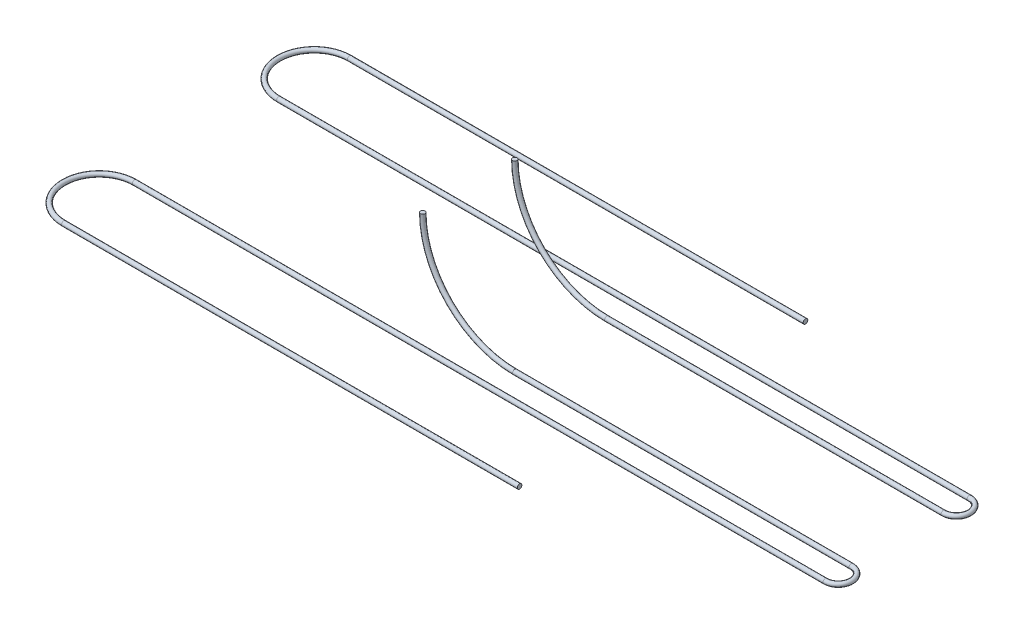
ISO-10303-21;
HEADER;
FILE_DESCRIPTION(('STEP AP214'),'2;1');
FILE_NAME('part.step','',(''),(''),'','','');
FILE_SCHEMA(('AUTOMOTIVE_DESIGN { 1 0 10303 214 1 1 1 1 }'));
ENDSEC;
DATA;
#1=APPLICATION_CONTEXT('core data for automotive mechanical design processes');
#2=APPLICATION_PROTOCOL_DEFINITION('international standard','automotive_design',2000,#1);
#3=PRODUCT_CONTEXT('',#1,'mechanical');
#4=PRODUCT('Part','Part','',(#3));
#5=PRODUCT_RELATED_PRODUCT_CATEGORY('part','',(#4));
#6=PRODUCT_DEFINITION_FORMATION('','',#4);
#7=PRODUCT_DEFINITION_CONTEXT('part definition',#1,'design');
#8=PRODUCT_DEFINITION('design','',#6,#7);
#9=PRODUCT_DEFINITION_SHAPE('','',#8);
#10=(LENGTH_UNIT() NAMED_UNIT(*) SI_UNIT(.MILLI.,.METRE.));
#11=(NAMED_UNIT(*) PLANE_ANGLE_UNIT() SI_UNIT($,.RADIAN.));
#12=(NAMED_UNIT(*) SI_UNIT($,.STERADIAN.) SOLID_ANGLE_UNIT());
#13=UNCERTAINTY_MEASURE_WITH_UNIT(LENGTH_MEASURE(1.E-05),#10,'distance_accuracy_value','');
#14=(GEOMETRIC_REPRESENTATION_CONTEXT(3) GLOBAL_UNCERTAINTY_ASSIGNED_CONTEXT((#13)) GLOBAL_UNIT_ASSIGNED_CONTEXT((#10,
#11,#12)) REPRESENTATION_CONTEXT('',''));
#15=CARTESIAN_POINT('',(0.,0.,0.));
#16=DIRECTION('',(0.,0.,1.));
#17=DIRECTION('',(1.,0.,0.));
#18=AXIS2_PLACEMENT_3D('',#15,#16,#17);
#19=CARTESIAN_POINT('',(22.09,0.,31.05));
#20=DIRECTION('',(1.,0.,0.));
#21=DIRECTION('',(0.,0.,1.));
#22=AXIS2_PLACEMENT_3D('',#19,#20,#21);
#23=PLANE('',#22);
#24=CARTESIAN_POINT('',(22.09,0.,31.05));
#25=DIRECTION('',(-1.,0.,0.));
#26=DIRECTION('',(0.,0.,1.));
#27=AXIS2_PLACEMENT_3D('',#24,#25,#26);
#28=CIRCLE('',#27,0.499999999999999);
#29=CARTESIAN_POINT('',(22.09,0.,31.55));
#30=VERTEX_POINT('',#29);
#31=EDGE_CURVE('E76',#30,#30,#28,.T.);
#32=ORIENTED_EDGE('',*,*,#31,.F.);
#33=EDGE_LOOP('',(#32));
#34=FACE_BOUND('',#33,.T.);
#35=ADVANCED_FACE('F45',(#34),#23,.T.);
#36=CARTESIAN_POINT('',(-20.,20.,10.));
#37=DIRECTION('',(0.,-1.,0.));
#38=DIRECTION('',(0.,0.,1.));
#39=AXIS2_PLACEMENT_3D('',#36,#37,#38);
#40=PLANE('',#39);
#41=CARTESIAN_POINT('',(-20.,20.,10.));
#42=DIRECTION('',(0.,1.,0.));
#43=DIRECTION('',(0.,0.,1.));
#44=AXIS2_PLACEMENT_3D('',#41,#42,#43);
#45=CIRCLE('',#44,0.499999999999999);
#46=CARTESIAN_POINT('',(-20.5,20.,10.));
#47=VERTEX_POINT('',#46);
#48=EDGE_CURVE('E11',#47,#47,#45,.T.);
#49=ORIENTED_EDGE('',*,*,#48,.T.);
#50=EDGE_LOOP('',(#49));
#51=FACE_BOUND('',#50,.T.);
#52=ADVANCED_FACE('F84',(#51),#40,.F.);
#53=CARTESIAN_POINT('',(22.09,0.,31.05));
#54=DIRECTION('',(-1.,0.,0.));
#55=DIRECTION('',(0.,0.,-1.));
#56=AXIS2_PLACEMENT_3D('',#53,#54,#55);
#57=CYLINDRICAL_SURFACE('',#56,0.499999999999999);
#58=CARTESIAN_POINT('',(-76.91,0.,31.05));
#59=DIRECTION('',(-1.,0.,0.));
#60=DIRECTION('',(0.,0.,1.));
#61=AXIS2_PLACEMENT_3D('',#58,#59,#60);
#62=CIRCLE('',#61,0.499999999999999);
#63=CARTESIAN_POINT('',(-76.91,0.,31.55));
#64=VERTEX_POINT('',#63);
#65=EDGE_CURVE('E72',#64,#64,#62,.T.);
#66=ORIENTED_EDGE('',*,*,#65,.F.);
#67=EDGE_LOOP('',(#66));
#68=FACE_BOUND('',#67,.T.);
#69=ORIENTED_EDGE('',*,*,#31,.T.);
#70=EDGE_LOOP('',(#69));
#71=FACE_BOUND('',#70,.T.);
#72=ADVANCED_FACE('F81',(#68,#71),#57,.T.);
#73=CARTESIAN_POINT('',(-76.91,0.,23.35));
#74=DIRECTION('',(0.,1.,0.));
#75=DIRECTION('',(0.,0.,-1.));
#76=AXIS2_PLACEMENT_3D('',#73,#74,#75);
#77=TOROIDAL_SURFACE('',#76,7.70000000000001,0.499999999999999);
#78=CARTESIAN_POINT('',(-76.91,0.,15.65));
#79=DIRECTION('',(1.,0.,0.));
#80=DIRECTION('',(0.,0.,-1.));
#81=AXIS2_PLACEMENT_3D('',#78,#79,#80);
#82=CIRCLE('',#81,0.499999999999999);
#83=CARTESIAN_POINT('',(-76.91,0.,15.15));
#84=VERTEX_POINT('',#83);
#85=EDGE_CURVE('E68',#84,#84,#82,.T.);
#86=CARTESIAN_POINT('',(-76.91,0.,23.35));
#87=DIRECTION('',(0.,1.,0.));
#88=DIRECTION('',(0.,0.,-1.));
#89=AXIS2_PLACEMENT_3D('',#86,#87,#88);
#90=CIRCLE('',#89,8.20000000000001);
#91=EDGE_CURVE('',#84,#64,#90,.T.);
#92=ORIENTED_EDGE('',*,*,#85,.F.);
#93=ORIENTED_EDGE('',*,*,#65,.T.);
#94=ORIENTED_EDGE('',*,*,#91,.T.);
#95=ORIENTED_EDGE('',*,*,#91,.F.);
#96=EDGE_LOOP('',(#92,#94,#93,#95));
#97=FACE_BOUND('',#96,.T.);
#98=ADVANCED_FACE('F91',(#97),#77,.T.);
#99=CARTESIAN_POINT('',(-76.91,0.,15.65));
#100=DIRECTION('',(1.,0.,0.));
#101=DIRECTION('',(0.,0.,1.));
#102=AXIS2_PLACEMENT_3D('',#99,#100,#101);
#103=CYLINDRICAL_SURFACE('',#102,0.499999999999999);
#104=CARTESIAN_POINT('',(73.09,0.,15.65));
#105=DIRECTION('',(1.,0.,0.));
#106=DIRECTION('',(0.,0.,-1.));
#107=AXIS2_PLACEMENT_3D('',#104,#105,#106);
#108=CIRCLE('',#107,0.499999999999999);
#109=CARTESIAN_POINT('',(73.09,0.,16.15));
#110=VERTEX_POINT('',#109);
#111=EDGE_CURVE('E62',#110,#110,#108,.T.);
#112=ORIENTED_EDGE('',*,*,#111,.F.);
#113=EDGE_LOOP('',(#112));
#114=FACE_BOUND('',#113,.T.);
#115=ORIENTED_EDGE('',*,*,#85,.T.);
#116=EDGE_LOOP('',(#115));
#117=FACE_BOUND('',#116,.T.);
#118=ADVANCED_FACE('F106',(#114,#117),#103,.T.);
#119=CARTESIAN_POINT('',(73.09,0.,12.825));
#120=DIRECTION('',(0.,-1.,0.));
#121=DIRECTION('',(0.,0.,1.));
#122=AXIS2_PLACEMENT_3D('',#119,#120,#121);
#123=TOROIDAL_SURFACE('',#122,2.82499999999998,0.499999999999999);
#124=CARTESIAN_POINT('',(73.09,0.,10.));
#125=DIRECTION('',(-1.,0.,0.));
#126=DIRECTION('',(0.,0.,1.));
#127=AXIS2_PLACEMENT_3D('',#124,#125,#126);
#128=CIRCLE('',#127,0.499999999999999);
#129=CARTESIAN_POINT('',(73.09,0.,9.50000000000002));
#130=VERTEX_POINT('',#129);
#131=EDGE_CURVE('E57',#130,#130,#128,.T.);
#132=CARTESIAN_POINT('',(73.09,0.,12.825));
#133=DIRECTION('',(0.,-1.,0.));
#134=DIRECTION('',(0.,0.,1.));
#135=AXIS2_PLACEMENT_3D('',#132,#133,#134);
#136=CIRCLE('',#135,3.32499999999998);
#137=EDGE_CURVE('',#130,#110,#136,.T.);
#138=ORIENTED_EDGE('',*,*,#131,.F.);
#139=ORIENTED_EDGE('',*,*,#111,.T.);
#140=ORIENTED_EDGE('',*,*,#137,.T.);
#141=ORIENTED_EDGE('',*,*,#137,.F.);
#142=EDGE_LOOP('',(#138,#140,#139,#141));
#143=FACE_BOUND('',#142,.T.);
#144=ADVANCED_FACE('F102',(#143),#123,.T.);
#145=CARTESIAN_POINT('',(73.09,0.,10.));
#146=DIRECTION('',(-1.,0.,0.));
#147=DIRECTION('',(0.,0.,-1.));
#148=AXIS2_PLACEMENT_3D('',#145,#146,#147);
#149=CYLINDRICAL_SURFACE('',#148,0.499999999999999);
#150=CARTESIAN_POINT('',(0.,0.,10.));
#151=DIRECTION('',(-1.,0.,0.));
#152=DIRECTION('',(0.,0.,1.));
#153=AXIS2_PLACEMENT_3D('',#150,#151,#152);
#154=CIRCLE('',#153,0.499999999999999);
#155=CARTESIAN_POINT('',(0.,-0.500000000000004,10.));
#156=VERTEX_POINT('',#155);
#157=EDGE_CURVE('E52',#156,#156,#154,.T.);
#158=ORIENTED_EDGE('',*,*,#157,.F.);
#159=EDGE_LOOP('',(#158));
#160=FACE_BOUND('',#159,.T.);
#161=ORIENTED_EDGE('',*,*,#131,.T.);
#162=EDGE_LOOP('',(#161));
#163=FACE_BOUND('',#162,.T.);
#164=ADVANCED_FACE('F98',(#160,#163),#149,.T.);
#165=CARTESIAN_POINT('',(0.,20.,10.));
#166=DIRECTION('',(0.,0.,1.));
#167=DIRECTION('',(-1.,0.,0.));
#168=AXIS2_PLACEMENT_3D('',#165,#166,#167);
#169=TOROIDAL_SURFACE('',#168,20.,0.499999999999999);
#170=CARTESIAN_POINT('',(0.,20.,10.));
#171=DIRECTION('',(0.,0.,1.));
#172=DIRECTION('',(-1.,0.,0.));
#173=AXIS2_PLACEMENT_3D('',#170,#171,#172);
#174=CIRCLE('',#173,20.5);
#175=EDGE_CURVE('',#47,#156,#174,.T.);
#176=ORIENTED_EDGE('',*,*,#48,.F.);
#177=ORIENTED_EDGE('',*,*,#157,.T.);
#178=ORIENTED_EDGE('',*,*,#175,.T.);
#179=ORIENTED_EDGE('',*,*,#175,.F.);
#180=EDGE_LOOP('',(#176,#178,#177,#179));
#181=FACE_BOUND('',#180,.T.);
#182=ADVANCED_FACE('F95',(#181),#169,.T.);
#183=CLOSED_SHELL('',(#35,#52,#72,#98,#118,#144,#164,#182));
#184=MANIFOLD_SOLID_BREP('B2',#183);
#185=CARTESIAN_POINT('',(22.09,0.,-31.05));
#186=DIRECTION('',(1.,0.,0.));
#187=DIRECTION('',(0.,0.,-1.));
#188=AXIS2_PLACEMENT_3D('',#185,#186,#187);
#189=PLANE('',#188);
#190=CARTESIAN_POINT('',(22.09,0.,-31.05));
#191=DIRECTION('',(1.,0.,0.));
#192=DIRECTION('',(0.,0.,-1.));
#193=AXIS2_PLACEMENT_3D('',#190,#191,#192);
#194=CIRCLE('',#193,0.499999999999999);
#195=CARTESIAN_POINT('',(22.09,0.,-31.55));
#196=VERTEX_POINT('',#195);
#197=EDGE_CURVE('E193',#196,#196,#194,.T.);
#198=ORIENTED_EDGE('',*,*,#197,.T.);
#199=EDGE_LOOP('',(#198));
#200=FACE_BOUND('',#199,.T.);
#201=ADVANCED_FACE('F168',(#200),#189,.T.);
#202=CARTESIAN_POINT('',(-20.,20.,-10.));
#203=DIRECTION('',(0.,-1.,0.));
#204=DIRECTION('',(0.,0.,-1.));
#205=AXIS2_PLACEMENT_3D('',#202,#203,#204);
#206=PLANE('',#205);
#207=CARTESIAN_POINT('',(-20.,20.,-10.));
#208=DIRECTION('',(0.,-1.,0.));
#209=DIRECTION('',(0.,0.,-1.));
#210=AXIS2_PLACEMENT_3D('',#207,#208,#209);
#211=CIRCLE('',#210,0.499999999999999);
#212=CARTESIAN_POINT('',(-20.5,20.,-10.));
#213=VERTEX_POINT('',#212);
#214=EDGE_CURVE('E44',#213,#213,#211,.T.);
#215=ORIENTED_EDGE('',*,*,#214,.F.);
#216=EDGE_LOOP('',(#215));
#217=FACE_BOUND('',#216,.T.);
#218=ADVANCED_FACE('F201',(#217),#206,.F.);
#219=CARTESIAN_POINT('',(22.09,0.,-31.05));
#220=DIRECTION('',(-1.,0.,0.));
#221=DIRECTION('',(0.,0.,1.));
#222=AXIS2_PLACEMENT_3D('',#219,#220,#221);
#223=CYLINDRICAL_SURFACE('',#222,0.499999999999999);
#224=CARTESIAN_POINT('',(-76.91,0.,-31.05));
#225=DIRECTION('',(1.,0.,0.));
#226=DIRECTION('',(0.,0.,-1.));
#227=AXIS2_PLACEMENT_3D('',#224,#225,#226);
#228=CIRCLE('',#227,0.499999999999999);
#229=CARTESIAN_POINT('',(-76.91,0.,-31.55));
#230=VERTEX_POINT('',#229);
#231=EDGE_CURVE('E190',#230,#230,#228,.T.);
#232=ORIENTED_EDGE('',*,*,#231,.T.);
#233=EDGE_LOOP('',(#232));
#234=FACE_BOUND('',#233,.T.);
#235=ORIENTED_EDGE('',*,*,#197,.F.);
#236=EDGE_LOOP('',(#235));
#237=FACE_BOUND('',#236,.T.);
#238=ADVANCED_FACE('F198',(#234,#237),#223,.T.);
#239=CARTESIAN_POINT('',(-76.91,0.,-23.35));
#240=DIRECTION('',(0.,1.,0.));
#241=DIRECTION('',(0.,0.,1.));
#242=AXIS2_PLACEMENT_3D('',#239,#240,#241);
#243=TOROIDAL_SURFACE('',#242,7.70000000000001,0.499999999999999);
#244=CARTESIAN_POINT('',(-76.91,0.,-15.65));
#245=DIRECTION('',(-1.,0.,0.));
#246=DIRECTION('',(0.,0.,1.));
#247=AXIS2_PLACEMENT_3D('',#244,#245,#246);
#248=CIRCLE('',#247,0.499999999999999);
#249=CARTESIAN_POINT('',(-76.91,0.,-15.15));
#250=VERTEX_POINT('',#249);
#251=EDGE_CURVE('E187',#250,#250,#248,.T.);
#252=CARTESIAN_POINT('',(-76.91,0.,-23.35));
#253=DIRECTION('',(0.,1.,0.));
#254=DIRECTION('',(0.,0.,1.));
#255=AXIS2_PLACEMENT_3D('',#252,#253,#254);
#256=CIRCLE('',#255,8.20000000000001);
#257=EDGE_CURVE('',#230,#250,#256,.T.);
#258=ORIENTED_EDGE('',*,*,#231,.F.);
#259=ORIENTED_EDGE('',*,*,#251,.T.);
#260=ORIENTED_EDGE('',*,*,#257,.T.);
#261=ORIENTED_EDGE('',*,*,#257,.F.);
#262=EDGE_LOOP('',(#258,#260,#259,#261));
#263=FACE_BOUND('',#262,.T.);
#264=ADVANCED_FACE('F200',(#263),#243,.T.);
#265=CARTESIAN_POINT('',(-76.91,0.,-15.65));
#266=DIRECTION('',(1.,0.,0.));
#267=DIRECTION('',(0.,0.,-1.));
#268=AXIS2_PLACEMENT_3D('',#265,#266,#267);
#269=CYLINDRICAL_SURFACE('',#268,0.499999999999999);
#270=CARTESIAN_POINT('',(73.09,0.,-15.65));
#271=DIRECTION('',(-1.,0.,0.));
#272=DIRECTION('',(0.,0.,1.));
#273=AXIS2_PLACEMENT_3D('',#270,#271,#272);
#274=CIRCLE('',#273,0.499999999999999);
#275=CARTESIAN_POINT('',(73.09,0.,-16.15));
#276=VERTEX_POINT('',#275);
#277=EDGE_CURVE('E182',#276,#276,#274,.T.);
#278=ORIENTED_EDGE('',*,*,#277,.T.);
#279=EDGE_LOOP('',(#278));
#280=FACE_BOUND('',#279,.T.);
#281=ORIENTED_EDGE('',*,*,#251,.F.);
#282=EDGE_LOOP('',(#281));
#283=FACE_BOUND('',#282,.T.);
#284=ADVANCED_FACE('F208',(#280,#283),#269,.T.);
#285=CARTESIAN_POINT('',(73.09,0.,-12.825));
#286=DIRECTION('',(0.,-1.,0.));
#287=DIRECTION('',(0.,0.,-1.));
#288=AXIS2_PLACEMENT_3D('',#285,#286,#287);
#289=TOROIDAL_SURFACE('',#288,2.82499999999998,0.499999999999999);
#290=CARTESIAN_POINT('',(73.09,0.,-10.));
#291=DIRECTION('',(1.,0.,0.));
#292=DIRECTION('',(0.,0.,-1.));
#293=AXIS2_PLACEMENT_3D('',#290,#291,#292);
#294=CIRCLE('',#293,0.499999999999999);
#295=CARTESIAN_POINT('',(73.09,0.,-9.50000000000002));
#296=VERTEX_POINT('',#295);
#297=EDGE_CURVE('E178',#296,#296,#294,.T.);
#298=CARTESIAN_POINT('',(73.09,0.,-12.825));
#299=DIRECTION('',(0.,-1.,0.));
#300=DIRECTION('',(0.,0.,-1.));
#301=AXIS2_PLACEMENT_3D('',#298,#299,#300);
#302=CIRCLE('',#301,3.32499999999998);
#303=EDGE_CURVE('',#276,#296,#302,.T.);
#304=ORIENTED_EDGE('',*,*,#277,.F.);
#305=ORIENTED_EDGE('',*,*,#297,.T.);
#306=ORIENTED_EDGE('',*,*,#303,.T.);
#307=ORIENTED_EDGE('',*,*,#303,.F.);
#308=EDGE_LOOP('',(#304,#306,#305,#307));
#309=FACE_BOUND('',#308,.T.);
#310=ADVANCED_FACE('F219',(#309),#289,.T.);
#311=CARTESIAN_POINT('',(73.09,0.,-10.));
#312=DIRECTION('',(-1.,0.,0.));
#313=DIRECTION('',(0.,0.,1.));
#314=AXIS2_PLACEMENT_3D('',#311,#312,#313);
#315=CYLINDRICAL_SURFACE('',#314,0.499999999999999);
#316=CARTESIAN_POINT('',(0.,0.,-10.));
#317=DIRECTION('',(1.,0.,0.));
#318=DIRECTION('',(0.,0.,-1.));
#319=AXIS2_PLACEMENT_3D('',#316,#317,#318);
#320=CIRCLE('',#319,0.499999999999999);
#321=CARTESIAN_POINT('',(0.,-0.500000000000004,-10.));
#322=VERTEX_POINT('',#321);
#323=EDGE_CURVE('E174',#322,#322,#320,.T.);
#324=ORIENTED_EDGE('',*,*,#323,.T.);
#325=EDGE_LOOP('',(#324));
#326=FACE_BOUND('',#325,.T.);
#327=ORIENTED_EDGE('',*,*,#297,.F.);
#328=EDGE_LOOP('',(#327));
#329=FACE_BOUND('',#328,.T.);
#330=ADVANCED_FACE('F214',(#326,#329),#315,.T.);
#331=CARTESIAN_POINT('',(0.,20.,-10.));
#332=DIRECTION('',(0.,0.,-1.));
#333=DIRECTION('',(-1.,0.,0.));
#334=AXIS2_PLACEMENT_3D('',#331,#332,#333);
#335=TOROIDAL_SURFACE('',#334,20.,0.499999999999999);
#336=CARTESIAN_POINT('',(0.,20.,-10.));
#337=DIRECTION('',(0.,0.,-1.));
#338=DIRECTION('',(-1.,0.,0.));
#339=AXIS2_PLACEMENT_3D('',#336,#337,#338);
#340=CIRCLE('',#339,20.5);
#341=EDGE_CURVE('',#322,#213,#340,.T.);
#342=ORIENTED_EDGE('',*,*,#323,.F.);
#343=ORIENTED_EDGE('',*,*,#214,.T.);
#344=ORIENTED_EDGE('',*,*,#341,.T.);
#345=ORIENTED_EDGE('',*,*,#341,.F.);
#346=EDGE_LOOP('',(#342,#344,#343,#345));
#347=FACE_BOUND('',#346,.T.);
#348=ADVANCED_FACE('F212',(#347),#335,.T.);
#349=CLOSED_SHELL('',(#201,#218,#238,#264,#284,#310,#330,#348));
#350=MANIFOLD_SOLID_BREP('B6',#349);
#351=ADVANCED_BREP_SHAPE_REPRESENTATION('',(#18,#184,#350),#14);
#352=SHAPE_DEFINITION_REPRESENTATION(#9,#351);
ENDSEC;
END-ISO-10303-21;
